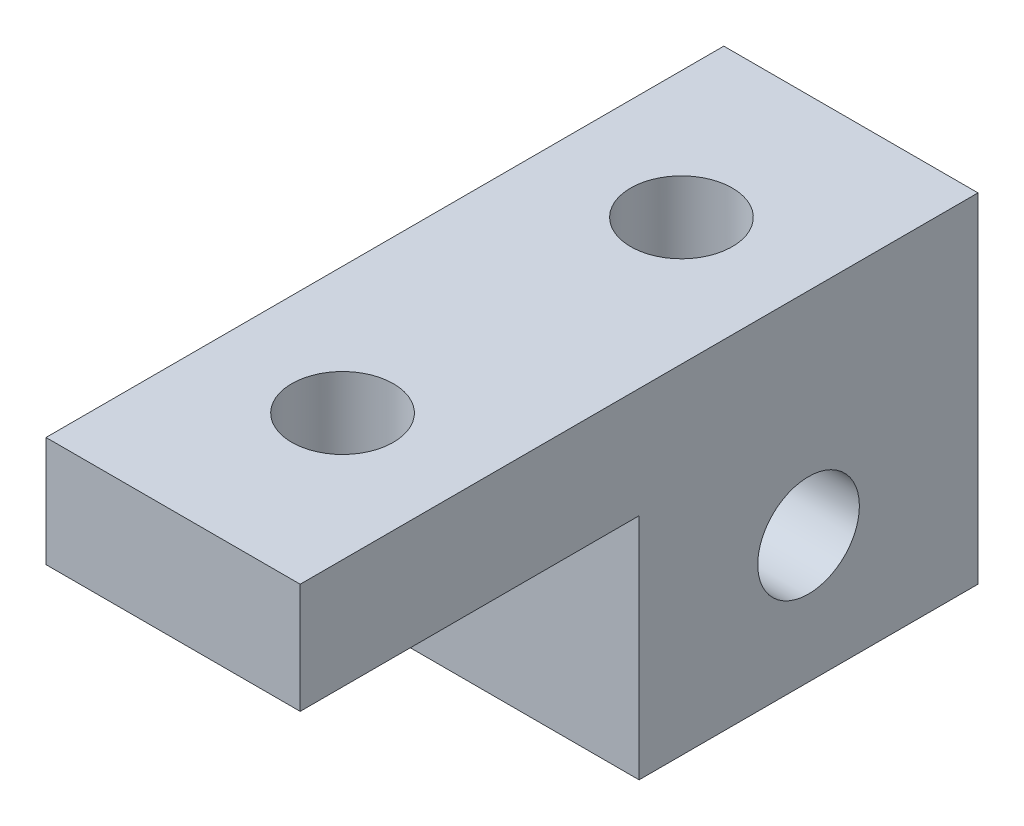
ISO-10303-21;
HEADER;
FILE_DESCRIPTION(('STEP AP214'),'2;1');
FILE_NAME('part.step','',(''),(''),'','','');
FILE_SCHEMA(('AUTOMOTIVE_DESIGN { 1 0 10303 214 1 1 1 1 }'));
ENDSEC;
DATA;
#1=APPLICATION_CONTEXT('core data for automotive mechanical design processes');
#2=APPLICATION_PROTOCOL_DEFINITION('international standard','automotive_design',2000,#1);
#3=PRODUCT_CONTEXT('',#1,'mechanical');
#4=PRODUCT('Part','Part','',(#3));
#5=PRODUCT_RELATED_PRODUCT_CATEGORY('part','',(#4));
#6=PRODUCT_DEFINITION_FORMATION('','',#4);
#7=PRODUCT_DEFINITION_CONTEXT('part definition',#1,'design');
#8=PRODUCT_DEFINITION('design','',#6,#7);
#9=PRODUCT_DEFINITION_SHAPE('','',#8);
#10=(LENGTH_UNIT() NAMED_UNIT(*) SI_UNIT(.MILLI.,.METRE.));
#11=(NAMED_UNIT(*) PLANE_ANGLE_UNIT() SI_UNIT($,.RADIAN.));
#12=(NAMED_UNIT(*) SI_UNIT($,.STERADIAN.) SOLID_ANGLE_UNIT());
#13=UNCERTAINTY_MEASURE_WITH_UNIT(LENGTH_MEASURE(1.E-05),#10,'distance_accuracy_value','');
#14=(GEOMETRIC_REPRESENTATION_CONTEXT(3) GLOBAL_UNCERTAINTY_ASSIGNED_CONTEXT((#13)) GLOBAL_UNIT_ASSIGNED_CONTEXT((#10,
#11,#12)) REPRESENTATION_CONTEXT('',''));
#15=CARTESIAN_POINT('',(0.,0.,0.));
#16=DIRECTION('',(0.,0.,1.));
#17=DIRECTION('',(1.,0.,0.));
#18=AXIS2_PLACEMENT_3D('',#15,#16,#17);
#19=CARTESIAN_POINT('',(3.,0.,0.));
#20=DIRECTION('',(1.,0.,0.));
#21=DIRECTION('',(0.,0.,-1.));
#22=AXIS2_PLACEMENT_3D('',#19,#20,#21);
#23=PLANE('',#22);
#24=CARTESIAN_POINT('',(3.,0.,0.));
#25=DIRECTION('',(1.,0.,0.));
#26=DIRECTION('',(0.,0.,-1.));
#27=AXIS2_PLACEMENT_3D('',#24,#25,#26);
#28=CIRCLE('',#27,0.6);
#29=CARTESIAN_POINT('',(3.,0.,-0.6));
#30=VERTEX_POINT('',#29);
#31=EDGE_CURVE('E144',#30,#30,#28,.T.);
#32=ORIENTED_EDGE('',*,*,#31,.F.);
#33=EDGE_LOOP('',(#32));
#34=FACE_BOUND('',#33,.T.);
#35=DIRECTION('',(0.,0.,1.));
#36=VECTOR('',#35,1.);
#37=CARTESIAN_POINT('',(3.,1.2,2.));
#38=LINE('',#37,#36);
#39=CARTESIAN_POINT('',(3.,1.2,2.));
#40=VERTEX_POINT('',#39);
#41=CARTESIAN_POINT('',(3.,1.2,6.));
#42=VERTEX_POINT('',#41);
#43=EDGE_CURVE('E121',#40,#42,#38,.T.);
#44=ORIENTED_EDGE('',*,*,#43,.F.);
#45=DIRECTION('',(0.,-1.,0.));
#46=VECTOR('',#45,1.);
#47=CARTESIAN_POINT('',(3.,0.,2.));
#48=LINE('',#47,#46);
#49=CARTESIAN_POINT('',(3.,-1.5,2.));
#50=VERTEX_POINT('',#49);
#51=EDGE_CURVE('E116',#40,#50,#48,.T.);
#52=ORIENTED_EDGE('',*,*,#51,.T.);
#53=DIRECTION('',(0.,0.,-1.));
#54=VECTOR('',#53,1.);
#55=CARTESIAN_POINT('',(3.,-1.5,0.));
#56=LINE('',#55,#54);
#57=CARTESIAN_POINT('',(3.,-1.5,-2.));
#58=VERTEX_POINT('',#57);
#59=EDGE_CURVE('E157',#50,#58,#56,.T.);
#60=ORIENTED_EDGE('',*,*,#59,.T.);
#61=DIRECTION('',(0.,-1.,0.));
#62=VECTOR('',#61,1.);
#63=CARTESIAN_POINT('',(3.,0.,-2.));
#64=LINE('',#63,#62);
#65=CARTESIAN_POINT('',(3.,2.5,-2.));
#66=VERTEX_POINT('',#65);
#67=EDGE_CURVE('E147',#66,#58,#64,.T.);
#68=ORIENTED_EDGE('',*,*,#67,.F.);
#69=DIRECTION('',(0.,0.,-1.));
#70=VECTOR('',#69,1.);
#71=CARTESIAN_POINT('',(3.,2.5,0.));
#72=LINE('',#71,#70);
#73=CARTESIAN_POINT('',(3.,2.5,6.));
#74=VERTEX_POINT('',#73);
#75=EDGE_CURVE('E150',#74,#66,#72,.T.);
#76=ORIENTED_EDGE('',*,*,#75,.F.);
#77=DIRECTION('',(0.,-1.,0.));
#78=VECTOR('',#77,1.);
#79=CARTESIAN_POINT('',(3.,0.,6.));
#80=LINE('',#79,#78);
#81=EDGE_CURVE('E153',#74,#42,#80,.T.);
#82=ORIENTED_EDGE('',*,*,#81,.T.);
#83=EDGE_LOOP('',(#44,#52,#60,#68,#76,#82));
#84=FACE_BOUND('',#83,.T.);
#85=ADVANCED_FACE('F38',(#34,#84),#23,.T.);
#86=CARTESIAN_POINT('',(0.,0.,0.));
#87=DIRECTION('',(1.,0.,0.));
#88=DIRECTION('',(0.,0.,-1.));
#89=AXIS2_PLACEMENT_3D('',#86,#87,#88);
#90=PLANE('',#89);
#91=CARTESIAN_POINT('',(0.,0.,0.));
#92=DIRECTION('',(1.,0.,0.));
#93=DIRECTION('',(0.,0.,-1.));
#94=AXIS2_PLACEMENT_3D('',#91,#92,#93);
#95=CIRCLE('',#94,0.6);
#96=CARTESIAN_POINT('',(0.,0.,-0.6));
#97=VERTEX_POINT('',#96);
#98=EDGE_CURVE('E143',#97,#97,#95,.T.);
#99=ORIENTED_EDGE('',*,*,#98,.T.);
#100=EDGE_LOOP('',(#99));
#101=FACE_BOUND('',#100,.T.);
#102=DIRECTION('',(0.,-1.,0.));
#103=VECTOR('',#102,1.);
#104=CARTESIAN_POINT('',(0.,0.,2.));
#105=LINE('',#104,#103);
#106=CARTESIAN_POINT('',(0.,1.2,2.));
#107=VERTEX_POINT('',#106);
#108=CARTESIAN_POINT('',(0.,-1.5,2.));
#109=VERTEX_POINT('',#108);
#110=EDGE_CURVE('E98',#107,#109,#105,.T.);
#111=ORIENTED_EDGE('',*,*,#110,.F.);
#112=DIRECTION('',(0.,0.,1.));
#113=VECTOR('',#112,1.);
#114=CARTESIAN_POINT('',(0.,1.2,2.));
#115=LINE('',#114,#113);
#116=CARTESIAN_POINT('',(0.,1.2,6.));
#117=VERTEX_POINT('',#116);
#118=EDGE_CURVE('E102',#107,#117,#115,.T.);
#119=ORIENTED_EDGE('',*,*,#118,.T.);
#120=DIRECTION('',(0.,-1.,0.));
#121=VECTOR('',#120,1.);
#122=CARTESIAN_POINT('',(0.,0.,6.));
#123=LINE('',#122,#121);
#124=CARTESIAN_POINT('',(0.,2.5,6.));
#125=VERTEX_POINT('',#124);
#126=EDGE_CURVE('E110',#125,#117,#123,.T.);
#127=ORIENTED_EDGE('',*,*,#126,.F.);
#128=DIRECTION('',(0.,0.,-1.));
#129=VECTOR('',#128,1.);
#130=CARTESIAN_POINT('',(0.,2.5,0.));
#131=LINE('',#130,#129);
#132=CARTESIAN_POINT('',(0.,2.5,-2.));
#133=VERTEX_POINT('',#132);
#134=EDGE_CURVE('E164',#125,#133,#131,.T.);
#135=ORIENTED_EDGE('',*,*,#134,.T.);
#136=DIRECTION('',(0.,-1.,0.));
#137=VECTOR('',#136,1.);
#138=CARTESIAN_POINT('',(0.,0.,-2.));
#139=LINE('',#138,#137);
#140=CARTESIAN_POINT('',(0.,-1.5,-2.));
#141=VERTEX_POINT('',#140);
#142=EDGE_CURVE('E162',#133,#141,#139,.T.);
#143=ORIENTED_EDGE('',*,*,#142,.T.);
#144=DIRECTION('',(0.,0.,-1.));
#145=VECTOR('',#144,1.);
#146=CARTESIAN_POINT('',(0.,-1.5,0.));
#147=LINE('',#146,#145);
#148=EDGE_CURVE('E106',#109,#141,#147,.T.);
#149=ORIENTED_EDGE('',*,*,#148,.F.);
#150=EDGE_LOOP('',(#111,#119,#127,#135,#143,#149));
#151=FACE_BOUND('',#150,.T.);
#152=ADVANCED_FACE('F100',(#101,#151),#90,.F.);
#153=CARTESIAN_POINT('',(3.,0.,0.));
#154=DIRECTION('',(-1.,0.,0.));
#155=DIRECTION('',(0.,0.,1.));
#156=AXIS2_PLACEMENT_3D('',#153,#154,#155);
#157=CYLINDRICAL_SURFACE('',#156,0.6);
#158=CARTESIAN_POINT('',(1.5,0.,0.));
#159=DIRECTION('',(-0.707106781186547,-0.707106781186547,0.));
#160=DIRECTION('',(-0.707106781186547,0.707106781186547,0.));
#161=AXIS2_PLACEMENT_3D('',#158,#159,#160);
#162=ELLIPSE('',#161,0.848528137423857,0.6);
#163=CARTESIAN_POINT('',(1.5,0.,0.6));
#164=VERTEX_POINT('',#163);
#165=CARTESIAN_POINT('',(1.5,0.,-0.6));
#166=VERTEX_POINT('',#165);
#167=EDGE_CURVE('E140',#164,#166,#162,.F.);
#168=ORIENTED_EDGE('',*,*,#167,.F.);
#169=CARTESIAN_POINT('',(1.5,0.,0.));
#170=DIRECTION('',(-0.707106781186547,0.707106781186547,0.));
#171=DIRECTION('',(-0.707106781186547,-0.707106781186547,0.));
#172=AXIS2_PLACEMENT_3D('',#169,#170,#171);
#173=ELLIPSE('',#172,0.848528137423857,0.6);
#174=EDGE_CURVE('E61',#166,#164,#173,.F.);
#175=ORIENTED_EDGE('',*,*,#174,.F.);
#176=EDGE_LOOP('',(#168,#175));
#177=FACE_BOUND('',#176,.T.);
#178=ORIENTED_EDGE('',*,*,#31,.T.);
#179=EDGE_LOOP('',(#178));
#180=FACE_BOUND('',#179,.T.);
#181=ADVANCED_FACE('F193',(#177,#180),#157,.F.);
#182=CARTESIAN_POINT('',(3.,0.,-2.));
#183=DIRECTION('',(0.,0.,-1.));
#184=DIRECTION('',(0.,1.,0.));
#185=AXIS2_PLACEMENT_3D('',#182,#183,#184);
#186=PLANE('',#185);
#187=ORIENTED_EDGE('',*,*,#142,.F.);
#188=DIRECTION('',(-1.,0.,0.));
#189=VECTOR('',#188,1.);
#190=CARTESIAN_POINT('',(3.,2.5,-2.));
#191=LINE('',#190,#189);
#192=EDGE_CURVE('E11',#66,#133,#191,.T.);
#193=ORIENTED_EDGE('',*,*,#192,.F.);
#194=ORIENTED_EDGE('',*,*,#67,.T.);
#195=DIRECTION('',(-1.,0.,0.));
#196=VECTOR('',#195,1.);
#197=CARTESIAN_POINT('',(3.,-1.5,-2.));
#198=LINE('',#197,#196);
#199=EDGE_CURVE('E159',#58,#141,#198,.T.);
#200=ORIENTED_EDGE('',*,*,#199,.T.);
#201=EDGE_LOOP('',(#187,#193,#194,#200));
#202=FACE_BOUND('',#201,.T.);
#203=ADVANCED_FACE('F182',(#202),#186,.T.);
#204=CARTESIAN_POINT('',(3.,2.5,0.));
#205=DIRECTION('',(0.,1.,0.));
#206=DIRECTION('',(0.,0.,1.));
#207=AXIS2_PLACEMENT_3D('',#204,#205,#206);
#208=PLANE('',#207);
#209=CARTESIAN_POINT('',(1.5,2.5,4.));
#210=DIRECTION('',(0.,-1.,0.));
#211=DIRECTION('',(0.,0.,-1.));
#212=AXIS2_PLACEMENT_3D('',#209,#210,#211);
#213=CIRCLE('',#212,0.6);
#214=CARTESIAN_POINT('',(1.5,2.5,3.4));
#215=VERTEX_POINT('',#214);
#216=EDGE_CURVE('E126',#215,#215,#213,.T.);
#217=ORIENTED_EDGE('',*,*,#216,.T.);
#218=EDGE_LOOP('',(#217));
#219=FACE_BOUND('',#218,.T.);
#220=CARTESIAN_POINT('',(1.5,2.5,0.));
#221=DIRECTION('',(0.,-1.,0.));
#222=DIRECTION('',(0.,0.,-1.));
#223=AXIS2_PLACEMENT_3D('',#220,#221,#222);
#224=CIRCLE('',#223,0.6);
#225=CARTESIAN_POINT('',(1.5,2.5,-0.6));
#226=VERTEX_POINT('',#225);
#227=EDGE_CURVE('E130',#226,#226,#224,.T.);
#228=ORIENTED_EDGE('',*,*,#227,.T.);
#229=EDGE_LOOP('',(#228));
#230=FACE_BOUND('',#229,.T.);
#231=ORIENTED_EDGE('',*,*,#134,.F.);
#232=DIRECTION('',(-1.,0.,0.));
#233=VECTOR('',#232,1.);
#234=CARTESIAN_POINT('',(3.,2.5,6.));
#235=LINE('',#234,#233);
#236=EDGE_CURVE('E47',#74,#125,#235,.T.);
#237=ORIENTED_EDGE('',*,*,#236,.F.);
#238=ORIENTED_EDGE('',*,*,#75,.T.);
#239=ORIENTED_EDGE('',*,*,#192,.T.);
#240=EDGE_LOOP('',(#231,#237,#238,#239));
#241=FACE_BOUND('',#240,.T.);
#242=ADVANCED_FACE('F178',(#219,#230,#241),#208,.T.);
#243=CARTESIAN_POINT('',(3.,0.,6.));
#244=DIRECTION('',(0.,0.,-1.));
#245=DIRECTION('',(-1.,0.,0.));
#246=AXIS2_PLACEMENT_3D('',#243,#244,#245);
#247=PLANE('',#246);
#248=ORIENTED_EDGE('',*,*,#126,.T.);
#249=DIRECTION('',(1.,0.,0.));
#250=VECTOR('',#249,1.);
#251=CARTESIAN_POINT('',(0.,1.2,6.));
#252=LINE('',#251,#250);
#253=EDGE_CURVE('E54',#117,#42,#252,.T.);
#254=ORIENTED_EDGE('',*,*,#253,.T.);
#255=ORIENTED_EDGE('',*,*,#81,.F.);
#256=ORIENTED_EDGE('',*,*,#236,.T.);
#257=EDGE_LOOP('',(#248,#254,#255,#256));
#258=FACE_BOUND('',#257,.T.);
#259=ADVANCED_FACE('F174',(#258),#247,.F.);
#260=CARTESIAN_POINT('',(3.,0.,2.));
#261=DIRECTION('',(0.,0.,-1.));
#262=DIRECTION('',(0.,1.,0.));
#263=AXIS2_PLACEMENT_3D('',#260,#261,#262);
#264=PLANE('',#263);
#265=ORIENTED_EDGE('',*,*,#110,.T.);
#266=DIRECTION('',(-1.,0.,0.));
#267=VECTOR('',#266,1.);
#268=CARTESIAN_POINT('',(3.,-1.5,2.));
#269=LINE('',#268,#267);
#270=EDGE_CURVE('E170',#50,#109,#269,.T.);
#271=ORIENTED_EDGE('',*,*,#270,.F.);
#272=ORIENTED_EDGE('',*,*,#51,.F.);
#273=DIRECTION('',(1.,0.,0.));
#274=VECTOR('',#273,1.);
#275=CARTESIAN_POINT('',(0.,1.2,2.));
#276=LINE('',#275,#274);
#277=EDGE_CURVE('E113',#107,#40,#276,.T.);
#278=ORIENTED_EDGE('',*,*,#277,.F.);
#279=EDGE_LOOP('',(#265,#271,#272,#278));
#280=FACE_BOUND('',#279,.T.);
#281=ADVANCED_FACE('F114',(#280),#264,.F.);
#282=CARTESIAN_POINT('',(1.5,0.,0.));
#283=DIRECTION('',(-0.707106781186547,-0.707106781186547,0.));
#284=DIRECTION('',(-0.707106781186547,0.707106781186547,0.));
#285=AXIS2_PLACEMENT_3D('',#282,#283,#284);
#286=ELLIPSE('',#285,0.848528137423857,0.6);
#287=EDGE_CURVE('E138',#164,#166,#286,.T.);
#288=ORIENTED_EDGE('',*,*,#287,.F.);
#289=CARTESIAN_POINT('',(1.5,0.,0.));
#290=DIRECTION('',(-0.707106781186547,0.707106781186547,0.));
#291=DIRECTION('',(-0.707106781186547,-0.707106781186547,0.));
#292=AXIS2_PLACEMENT_3D('',#289,#290,#291);
#293=ELLIPSE('',#292,0.848528137423857,0.6);
#294=EDGE_CURVE('E136',#166,#164,#293,.T.);
#295=ORIENTED_EDGE('',*,*,#294,.F.);
#296=EDGE_LOOP('',(#288,#295));
#297=FACE_BOUND('',#296,.T.);
#298=ORIENTED_EDGE('',*,*,#98,.F.);
#299=EDGE_LOOP('',(#298));
#300=FACE_BOUND('',#299,.T.);
#301=ADVANCED_FACE('F40',(#297,#300),#157,.F.);
#302=CARTESIAN_POINT('',(3.,-1.5,0.));
#303=DIRECTION('',(0.,1.,0.));
#304=DIRECTION('',(0.,0.,1.));
#305=AXIS2_PLACEMENT_3D('',#302,#303,#304);
#306=PLANE('',#305);
#307=CARTESIAN_POINT('',(1.5,-1.5,0.));
#308=DIRECTION('',(0.,-1.,0.));
#309=DIRECTION('',(0.,0.,-1.));
#310=AXIS2_PLACEMENT_3D('',#307,#308,#309);
#311=CIRCLE('',#310,0.6);
#312=CARTESIAN_POINT('',(1.5,-1.5,-0.6));
#313=VERTEX_POINT('',#312);
#314=EDGE_CURVE('E129',#313,#313,#311,.T.);
#315=ORIENTED_EDGE('',*,*,#314,.F.);
#316=EDGE_LOOP('',(#315));
#317=FACE_BOUND('',#316,.T.);
#318=ORIENTED_EDGE('',*,*,#148,.T.);
#319=ORIENTED_EDGE('',*,*,#199,.F.);
#320=ORIENTED_EDGE('',*,*,#59,.F.);
#321=ORIENTED_EDGE('',*,*,#270,.T.);
#322=EDGE_LOOP('',(#318,#319,#320,#321));
#323=FACE_BOUND('',#322,.T.);
#324=ADVANCED_FACE('F185',(#317,#323),#306,.F.);
#325=CARTESIAN_POINT('',(1.5,2.5,0.));
#326=DIRECTION('',(0.,-1.,0.));
#327=DIRECTION('',(0.,0.,-1.));
#328=AXIS2_PLACEMENT_3D('',#325,#326,#327);
#329=CYLINDRICAL_SURFACE('',#328,0.6);
#330=ORIENTED_EDGE('',*,*,#167,.T.);
#331=ORIENTED_EDGE('',*,*,#294,.T.);
#332=EDGE_LOOP('',(#330,#331));
#333=FACE_BOUND('',#332,.T.);
#334=ORIENTED_EDGE('',*,*,#314,.T.);
#335=EDGE_LOOP('',(#334));
#336=FACE_BOUND('',#335,.T.);
#337=ADVANCED_FACE('F198',(#333,#336),#329,.F.);
#338=ORIENTED_EDGE('',*,*,#287,.T.);
#339=ORIENTED_EDGE('',*,*,#174,.T.);
#340=EDGE_LOOP('',(#338,#339));
#341=FACE_BOUND('',#340,.T.);
#342=ORIENTED_EDGE('',*,*,#227,.F.);
#343=EDGE_LOOP('',(#342));
#344=FACE_BOUND('',#343,.T.);
#345=ADVANCED_FACE('F226',(#341,#344),#329,.F.);
#346=CARTESIAN_POINT('',(1.5,2.5,4.));
#347=DIRECTION('',(0.,-1.,0.));
#348=DIRECTION('',(0.,0.,-1.));
#349=AXIS2_PLACEMENT_3D('',#346,#347,#348);
#350=CYLINDRICAL_SURFACE('',#349,0.6);
#351=CARTESIAN_POINT('',(1.5,1.2,4.));
#352=DIRECTION('',(0.,1.,0.));
#353=DIRECTION('',(0.,0.,1.));
#354=AXIS2_PLACEMENT_3D('',#351,#352,#353);
#355=CIRCLE('',#354,0.6);
#356=CARTESIAN_POINT('',(1.5,1.2,4.6));
#357=VERTEX_POINT('',#356);
#358=EDGE_CURVE('E42',#357,#357,#355,.F.);
#359=ORIENTED_EDGE('',*,*,#358,.T.);
#360=EDGE_LOOP('',(#359));
#361=FACE_BOUND('',#360,.T.);
#362=ORIENTED_EDGE('',*,*,#216,.F.);
#363=EDGE_LOOP('',(#362));
#364=FACE_BOUND('',#363,.T.);
#365=ADVANCED_FACE('F235',(#361,#364),#350,.F.);
#366=CARTESIAN_POINT('',(0.,1.2,2.));
#367=DIRECTION('',(0.,1.,0.));
#368=DIRECTION('',(0.,0.,1.));
#369=AXIS2_PLACEMENT_3D('',#366,#367,#368);
#370=PLANE('',#369);
#371=ORIENTED_EDGE('',*,*,#43,.T.);
#372=ORIENTED_EDGE('',*,*,#253,.F.);
#373=ORIENTED_EDGE('',*,*,#118,.F.);
#374=ORIENTED_EDGE('',*,*,#277,.T.);
#375=EDGE_LOOP('',(#371,#372,#373,#374));
#376=FACE_BOUND('',#375,.T.);
#377=ORIENTED_EDGE('',*,*,#358,.F.);
#378=EDGE_LOOP('',(#377));
#379=FACE_BOUND('',#378,.T.);
#380=ADVANCED_FACE('F119',(#376,#379),#370,.F.);
#381=CLOSED_SHELL('',(#85,#152,#181,#203,#242,#259,#281,#301,#324,#337,#345,#365,#380));
#382=MANIFOLD_SOLID_BREP('B2',#381);
#383=ADVANCED_BREP_SHAPE_REPRESENTATION('',(#18,#382),#14);
#384=SHAPE_DEFINITION_REPRESENTATION(#9,#383);
ENDSEC;
END-ISO-10303-21;
